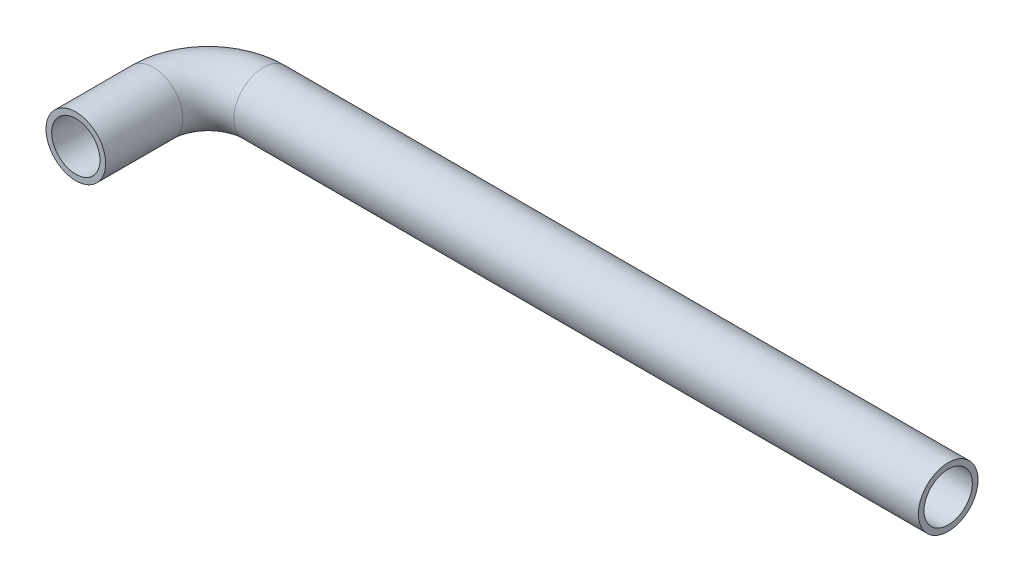
ISO-10303-21;
HEADER;
FILE_DESCRIPTION(('STEP AP214'),'2;1');
FILE_NAME('part.step','',(''),(''),'','','');
FILE_SCHEMA(('AUTOMOTIVE_DESIGN { 1 0 10303 214 1 1 1 1 }'));
ENDSEC;
DATA;
#1=APPLICATION_CONTEXT('core data for automotive mechanical design processes');
#2=APPLICATION_PROTOCOL_DEFINITION('international standard','automotive_design',2000,#1);
#3=PRODUCT_CONTEXT('',#1,'mechanical');
#4=PRODUCT('Part','Part','',(#3));
#5=PRODUCT_RELATED_PRODUCT_CATEGORY('part','',(#4));
#6=PRODUCT_DEFINITION_FORMATION('','',#4);
#7=PRODUCT_DEFINITION_CONTEXT('part definition',#1,'design');
#8=PRODUCT_DEFINITION('design','',#6,#7);
#9=PRODUCT_DEFINITION_SHAPE('','',#8);
#10=(LENGTH_UNIT() NAMED_UNIT(*) SI_UNIT(.MILLI.,.METRE.));
#11=(NAMED_UNIT(*) PLANE_ANGLE_UNIT() SI_UNIT($,.RADIAN.));
#12=(NAMED_UNIT(*) SI_UNIT($,.STERADIAN.) SOLID_ANGLE_UNIT());
#13=UNCERTAINTY_MEASURE_WITH_UNIT(LENGTH_MEASURE(1.E-05),#10,'distance_accuracy_value','');
#14=(GEOMETRIC_REPRESENTATION_CONTEXT(3) GLOBAL_UNCERTAINTY_ASSIGNED_CONTEXT((#13)) GLOBAL_UNIT_ASSIGNED_CONTEXT((#10,
#11,#12)) REPRESENTATION_CONTEXT('',''));
#15=CARTESIAN_POINT('',(0.,0.,0.));
#16=DIRECTION('',(0.,0.,1.));
#17=DIRECTION('',(1.,0.,0.));
#18=AXIS2_PLACEMENT_3D('',#15,#16,#17);
#19=CARTESIAN_POINT('',(0.,0.,0.));
#20=DIRECTION('',(0.,0.,-1.));
#21=DIRECTION('',(-1.,0.,0.));
#22=AXIS2_PLACEMENT_3D('',#19,#20,#21);
#23=CYLINDRICAL_SURFACE('',#22,6.858);
#24=CARTESIAN_POINT('',(0.,0.,-17.78));
#25=DIRECTION('',(0.,0.,1.));
#26=DIRECTION('',(1.,0.,0.));
#27=AXIS2_PLACEMENT_3D('',#24,#25,#26);
#28=CIRCLE('',#27,6.858);
#29=CARTESIAN_POINT('',(-6.858,0.,-17.78));
#30=VERTEX_POINT('',#29);
#31=EDGE_CURVE('E64',#30,#30,#28,.T.);
#32=ORIENTED_EDGE('',*,*,#31,.T.);
#33=EDGE_LOOP('',(#32));
#34=FACE_BOUND('',#33,.T.);
#35=CARTESIAN_POINT('',(0.,0.,0.));
#36=DIRECTION('',(0.,0.,1.));
#37=DIRECTION('',(1.,0.,0.));
#38=AXIS2_PLACEMENT_3D('',#35,#36,#37);
#39=CIRCLE('',#38,6.858);
#40=CARTESIAN_POINT('',(6.858,0.,0.));
#41=VERTEX_POINT('',#40);
#42=EDGE_CURVE('E61',#41,#41,#39,.T.);
#43=ORIENTED_EDGE('',*,*,#42,.F.);
#44=EDGE_LOOP('',(#43));
#45=FACE_BOUND('',#44,.T.);
#46=ADVANCED_FACE('F37',(#34,#45),#23,.T.);
#47=CARTESIAN_POINT('',(12.7,0.,-17.78));
#48=DIRECTION('',(0.,-1.,0.));
#49=DIRECTION('',(0.,0.,-1.));
#50=AXIS2_PLACEMENT_3D('',#47,#48,#49);
#51=TOROIDAL_SURFACE('',#50,12.7,6.858);
#52=CARTESIAN_POINT('',(12.7,0.,-30.48));
#53=DIRECTION('',(-1.,0.,0.));
#54=DIRECTION('',(0.,0.,1.));
#55=AXIS2_PLACEMENT_3D('',#52,#53,#54);
#56=CIRCLE('',#55,6.858);
#57=CARTESIAN_POINT('',(12.7,0.,-37.338));
#58=VERTEX_POINT('',#57);
#59=EDGE_CURVE('E41',#58,#58,#56,.T.);
#60=CARTESIAN_POINT('',(12.7,0.,-17.78));
#61=DIRECTION('',(0.,-1.,0.));
#62=DIRECTION('',(0.,0.,-1.));
#63=AXIS2_PLACEMENT_3D('',#60,#61,#62);
#64=CIRCLE('',#63,19.558);
#65=EDGE_CURVE('',#30,#58,#64,.T.);
#66=ORIENTED_EDGE('',*,*,#31,.F.);
#67=ORIENTED_EDGE('',*,*,#59,.T.);
#68=ORIENTED_EDGE('',*,*,#65,.T.);
#69=ORIENTED_EDGE('',*,*,#65,.F.);
#70=EDGE_LOOP('',(#66,#68,#67,#69));
#71=FACE_BOUND('',#70,.T.);
#72=ADVANCED_FACE('F73',(#71),#51,.T.);
#73=CARTESIAN_POINT('',(12.7,0.,-30.48));
#74=DIRECTION('',(1.,0.,0.));
#75=DIRECTION('',(0.,0.,-1.));
#76=AXIS2_PLACEMENT_3D('',#73,#74,#75);
#77=CYLINDRICAL_SURFACE('',#76,6.858);
#78=CARTESIAN_POINT('',(170.18,0.,-30.48));
#79=DIRECTION('',(-1.,0.,0.));
#80=DIRECTION('',(0.,0.,1.));
#81=AXIS2_PLACEMENT_3D('',#78,#79,#80);
#82=CIRCLE('',#81,6.858);
#83=CARTESIAN_POINT('',(170.18,0.,-23.622));
#84=VERTEX_POINT('',#83);
#85=EDGE_CURVE('E56',#84,#84,#82,.T.);
#86=ORIENTED_EDGE('',*,*,#85,.T.);
#87=EDGE_LOOP('',(#86));
#88=FACE_BOUND('',#87,.T.);
#89=ORIENTED_EDGE('',*,*,#59,.F.);
#90=EDGE_LOOP('',(#89));
#91=FACE_BOUND('',#90,.T.);
#92=ADVANCED_FACE('F39',(#88,#91),#77,.T.);
#93=CARTESIAN_POINT('',(0.,0.,0.));
#94=DIRECTION('',(0.,0.,1.));
#95=DIRECTION('',(1.,0.,0.));
#96=AXIS2_PLACEMENT_3D('',#93,#94,#95);
#97=PLANE('',#96);
#98=CARTESIAN_POINT('',(0.,0.,0.));
#99=DIRECTION('',(0.,0.,1.));
#100=DIRECTION('',(1.,0.,0.));
#101=AXIS2_PLACEMENT_3D('',#98,#99,#100);
#102=CIRCLE('',#101,5.55625);
#103=CARTESIAN_POINT('',(5.55625,0.,0.));
#104=VERTEX_POINT('',#103);
#105=EDGE_CURVE('E60',#104,#104,#102,.F.);
#106=ORIENTED_EDGE('',*,*,#105,.T.);
#107=EDGE_LOOP('',(#106));
#108=FACE_BOUND('',#107,.T.);
#109=ORIENTED_EDGE('',*,*,#42,.T.);
#110=EDGE_LOOP('',(#109));
#111=FACE_BOUND('',#110,.T.);
#112=ADVANCED_FACE('F77',(#108,#111),#97,.T.);
#113=CARTESIAN_POINT('',(170.18,0.,-30.48));
#114=DIRECTION('',(-1.,0.,0.));
#115=DIRECTION('',(0.,0.,1.));
#116=AXIS2_PLACEMENT_3D('',#113,#114,#115);
#117=PLANE('',#116);
#118=CARTESIAN_POINT('',(170.18,0.,-30.48));
#119=DIRECTION('',(-1.,0.,0.));
#120=DIRECTION('',(0.,0.,1.));
#121=AXIS2_PLACEMENT_3D('',#118,#119,#120);
#122=CIRCLE('',#121,5.55625);
#123=CARTESIAN_POINT('',(170.18,0.,-24.92375));
#124=VERTEX_POINT('',#123);
#125=EDGE_CURVE('E10',#124,#124,#122,.F.);
#126=ORIENTED_EDGE('',*,*,#125,.F.);
#127=EDGE_LOOP('',(#126));
#128=FACE_BOUND('',#127,.T.);
#129=ORIENTED_EDGE('',*,*,#85,.F.);
#130=EDGE_LOOP('',(#129));
#131=FACE_BOUND('',#130,.T.);
#132=ADVANCED_FACE('F83',(#128,#131),#117,.F.);
#133=CARTESIAN_POINT('',(0.,0.,0.));
#134=DIRECTION('',(0.,0.,-1.));
#135=DIRECTION('',(-1.,0.,0.));
#136=AXIS2_PLACEMENT_3D('',#133,#134,#135);
#137=CYLINDRICAL_SURFACE('',#136,5.55625);
#138=CARTESIAN_POINT('',(0.,0.,-17.78));
#139=DIRECTION('',(0.,0.,1.));
#140=DIRECTION('',(1.,0.,0.));
#141=AXIS2_PLACEMENT_3D('',#138,#139,#140);
#142=CIRCLE('',#141,5.55625);
#143=CARTESIAN_POINT('',(-5.55625,0.,-17.78));
#144=VERTEX_POINT('',#143);
#145=EDGE_CURVE('E52',#144,#144,#142,.F.);
#146=ORIENTED_EDGE('',*,*,#145,.T.);
#147=EDGE_LOOP('',(#146));
#148=FACE_BOUND('',#147,.T.);
#149=ORIENTED_EDGE('',*,*,#105,.F.);
#150=EDGE_LOOP('',(#149));
#151=FACE_BOUND('',#150,.T.);
#152=ADVANCED_FACE('F93',(#148,#151),#137,.F.);
#153=CARTESIAN_POINT('',(12.7,0.,-17.78));
#154=DIRECTION('',(0.,-1.,0.));
#155=DIRECTION('',(0.,0.,-1.));
#156=AXIS2_PLACEMENT_3D('',#153,#154,#155);
#157=TOROIDAL_SURFACE('',#156,12.7,5.55625);
#158=CARTESIAN_POINT('',(12.7,0.,-30.48));
#159=DIRECTION('',(-1.,0.,0.));
#160=DIRECTION('',(0.,0.,1.));
#161=AXIS2_PLACEMENT_3D('',#158,#159,#160);
#162=CIRCLE('',#161,5.55625);
#163=CARTESIAN_POINT('',(12.7,0.,-36.03625));
#164=VERTEX_POINT('',#163);
#165=EDGE_CURVE('E46',#164,#164,#162,.F.);
#166=CARTESIAN_POINT('',(12.7,0.,-17.78));
#167=DIRECTION('',(0.,-1.,0.));
#168=DIRECTION('',(0.,0.,-1.));
#169=AXIS2_PLACEMENT_3D('',#166,#167,#168);
#170=CIRCLE('',#169,18.25625);
#171=EDGE_CURVE('',#144,#164,#170,.T.);
#172=ORIENTED_EDGE('',*,*,#145,.F.);
#173=ORIENTED_EDGE('',*,*,#165,.T.);
#174=ORIENTED_EDGE('',*,*,#171,.T.);
#175=ORIENTED_EDGE('',*,*,#171,.F.);
#176=EDGE_LOOP('',(#172,#174,#173,#175));
#177=FACE_BOUND('',#176,.T.);
#178=ADVANCED_FACE('F88',(#177),#157,.F.);
#179=CARTESIAN_POINT('',(12.7,0.,-30.48));
#180=DIRECTION('',(1.,0.,0.));
#181=DIRECTION('',(0.,0.,-1.));
#182=AXIS2_PLACEMENT_3D('',#179,#180,#181);
#183=CYLINDRICAL_SURFACE('',#182,5.55625);
#184=ORIENTED_EDGE('',*,*,#125,.T.);
#185=EDGE_LOOP('',(#184));
#186=FACE_BOUND('',#185,.T.);
#187=ORIENTED_EDGE('',*,*,#165,.F.);
#188=EDGE_LOOP('',(#187));
#189=FACE_BOUND('',#188,.T.);
#190=ADVANCED_FACE('F86',(#186,#189),#183,.F.);
#191=CLOSED_SHELL('',(#46,#72,#92,#112,#132,#152,#178,#190));
#192=MANIFOLD_SOLID_BREP('B2',#191);
#193=ADVANCED_BREP_SHAPE_REPRESENTATION('',(#18,#192),#14);
#194=SHAPE_DEFINITION_REPRESENTATION(#9,#193);
ENDSEC;
END-ISO-10303-21;
